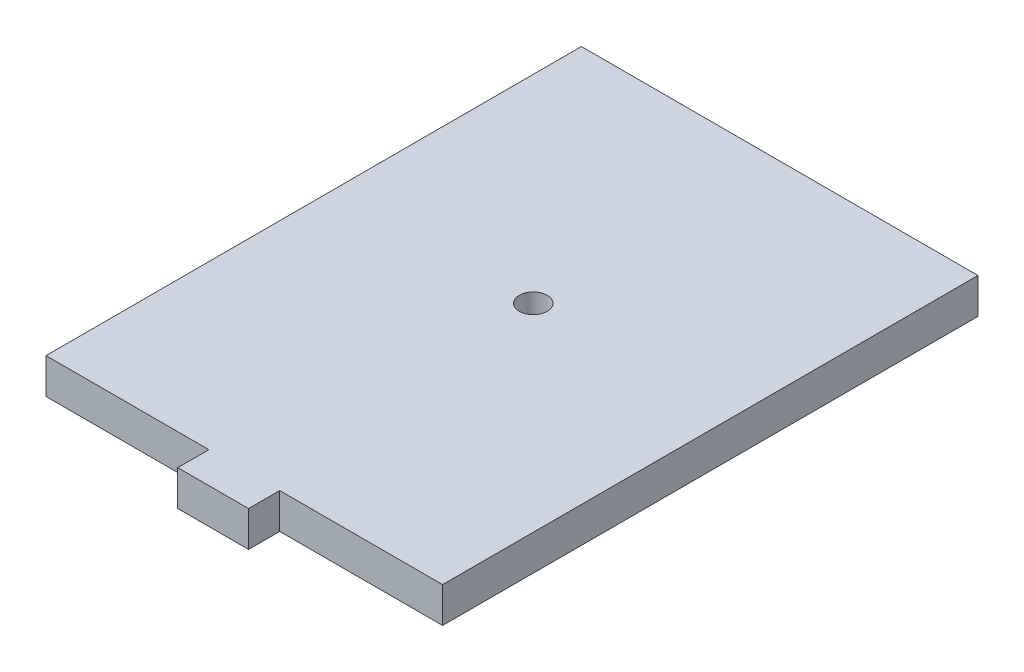
ISO-10303-21;
HEADER;
FILE_DESCRIPTION(('STEP AP214'),'2;1');
FILE_NAME('part.step','',(''),(''),'','','');
FILE_SCHEMA(('AUTOMOTIVE_DESIGN { 1 0 10303 214 1 1 1 1 }'));
ENDSEC;
DATA;
#1=APPLICATION_CONTEXT('core data for automotive mechanical design processes');
#2=APPLICATION_PROTOCOL_DEFINITION('international standard','automotive_design',2000,#1);
#3=PRODUCT_CONTEXT('',#1,'mechanical');
#4=PRODUCT('Part','Part','',(#3));
#5=PRODUCT_RELATED_PRODUCT_CATEGORY('part','',(#4));
#6=PRODUCT_DEFINITION_FORMATION('','',#4);
#7=PRODUCT_DEFINITION_CONTEXT('part definition',#1,'design');
#8=PRODUCT_DEFINITION('design','',#6,#7);
#9=PRODUCT_DEFINITION_SHAPE('','',#8);
#10=(LENGTH_UNIT() NAMED_UNIT(*) SI_UNIT(.MILLI.,.METRE.));
#11=(NAMED_UNIT(*) PLANE_ANGLE_UNIT() SI_UNIT($,.RADIAN.));
#12=(NAMED_UNIT(*) SI_UNIT($,.STERADIAN.) SOLID_ANGLE_UNIT());
#13=UNCERTAINTY_MEASURE_WITH_UNIT(LENGTH_MEASURE(1.E-05),#10,'distance_accuracy_value','');
#14=(GEOMETRIC_REPRESENTATION_CONTEXT(3) GLOBAL_UNCERTAINTY_ASSIGNED_CONTEXT((#13)) GLOBAL_UNIT_ASSIGNED_CONTEXT((#10,
#11,#12)) REPRESENTATION_CONTEXT('',''));
#15=CARTESIAN_POINT('',(0.,0.,0.));
#16=DIRECTION('',(0.,0.,1.));
#17=DIRECTION('',(1.,0.,0.));
#18=AXIS2_PLACEMENT_3D('',#15,#16,#17);
#19=CARTESIAN_POINT('',(0.,3.175,50.8));
#20=DIRECTION('',(1.,0.,0.));
#21=DIRECTION('',(0.,1.,0.));
#22=AXIS2_PLACEMENT_3D('',#19,#20,#21);
#23=PLANE('',#22);
#24=DIRECTION('',(0.,0.,-1.));
#25=VECTOR('',#24,1.);
#26=CARTESIAN_POINT('',(0.,0.,50.8));
#27=LINE('',#26,#25);
#28=CARTESIAN_POINT('',(0.,0.,48.006));
#29=VERTEX_POINT('',#28);
#30=CARTESIAN_POINT('',(0.,0.,0.));
#31=VERTEX_POINT('',#30);
#32=EDGE_CURVE('E11',#29,#31,#27,.T.);
#33=ORIENTED_EDGE('',*,*,#32,.F.);
#34=DIRECTION('',(0.,1.,0.));
#35=VECTOR('',#34,1.);
#36=CARTESIAN_POINT('',(0.,0.,48.006));
#37=LINE('',#36,#35);
#38=CARTESIAN_POINT('',(0.,3.175,48.006));
#39=VERTEX_POINT('',#38);
#40=EDGE_CURVE('E103',#29,#39,#37,.T.);
#41=ORIENTED_EDGE('',*,*,#40,.T.);
#42=DIRECTION('',(0.,0.,-1.));
#43=VECTOR('',#42,1.);
#44=CARTESIAN_POINT('',(0.,3.175,50.8));
#45=LINE('',#44,#43);
#46=CARTESIAN_POINT('',(0.,3.175,0.));
#47=VERTEX_POINT('',#46);
#48=EDGE_CURVE('E152',#39,#47,#45,.T.);
#49=ORIENTED_EDGE('',*,*,#48,.T.);
#50=DIRECTION('',(0.,-1.,0.));
#51=VECTOR('',#50,1.);
#52=CARTESIAN_POINT('',(0.,3.175,0.));
#53=LINE('',#52,#51);
#54=EDGE_CURVE('E144',#47,#31,#53,.T.);
#55=ORIENTED_EDGE('',*,*,#54,.T.);
#56=EDGE_LOOP('',(#33,#41,#49,#55));
#57=FACE_BOUND('',#56,.T.);
#58=ADVANCED_FACE('F35',(#57),#23,.F.);
#59=CARTESIAN_POINT('',(0.,0.,50.8));
#60=DIRECTION('',(0.,1.,0.));
#61=DIRECTION('',(-1.,0.,0.));
#62=AXIS2_PLACEMENT_3D('',#59,#60,#61);
#63=PLANE('',#62);
#64=CARTESIAN_POINT('',(17.78,0.,22.098));
#65=DIRECTION('',(0.,1.,0.));
#66=DIRECTION('',(-1.,0.,0.));
#67=AXIS2_PLACEMENT_3D('',#64,#65,#66);
#68=CIRCLE('',#67,1.25);
#69=CARTESIAN_POINT('',(16.53,0.,22.098));
#70=VERTEX_POINT('',#69);
#71=EDGE_CURVE('E141',#70,#70,#68,.T.);
#72=ORIENTED_EDGE('',*,*,#71,.T.);
#73=EDGE_LOOP('',(#72));
#74=FACE_BOUND('',#73,.T.);
#75=DIRECTION('',(0.,0.,-1.));
#76=VECTOR('',#75,1.);
#77=CARTESIAN_POINT('',(14.605,0.,50.8));
#78=LINE('',#77,#76);
#79=CARTESIAN_POINT('',(14.605,0.,50.8));
#80=VERTEX_POINT('',#79);
#81=CARTESIAN_POINT('',(14.605,0.,48.006));
#82=VERTEX_POINT('',#81);
#83=EDGE_CURVE('E57',#80,#82,#78,.T.);
#84=ORIENTED_EDGE('',*,*,#83,.T.);
#85=DIRECTION('',(-1.,0.,0.));
#86=VECTOR('',#85,1.);
#87=CARTESIAN_POINT('',(0.,0.,48.006));
#88=LINE('',#87,#86);
#89=EDGE_CURVE('E107',#82,#29,#88,.T.);
#90=ORIENTED_EDGE('',*,*,#89,.T.);
#91=ORIENTED_EDGE('',*,*,#32,.T.);
#92=DIRECTION('',(1.,0.,0.));
#93=VECTOR('',#92,1.);
#94=CARTESIAN_POINT('',(0.,0.,0.));
#95=LINE('',#94,#93);
#96=CARTESIAN_POINT('',(35.56,0.,0.));
#97=VERTEX_POINT('',#96);
#98=EDGE_CURVE('E155',#31,#97,#95,.T.);
#99=ORIENTED_EDGE('',*,*,#98,.T.);
#100=DIRECTION('',(0.,0.,-1.));
#101=VECTOR('',#100,1.);
#102=CARTESIAN_POINT('',(35.56,0.,50.8));
#103=LINE('',#102,#101);
#104=CARTESIAN_POINT('',(35.56,0.,48.006));
#105=VERTEX_POINT('',#104);
#106=EDGE_CURVE('E42',#105,#97,#103,.T.);
#107=ORIENTED_EDGE('',*,*,#106,.F.);
#108=DIRECTION('',(-1.,0.,0.));
#109=VECTOR('',#108,1.);
#110=CARTESIAN_POINT('',(35.56,0.,48.006));
#111=LINE('',#110,#109);
#112=CARTESIAN_POINT('',(20.955,0.,48.006));
#113=VERTEX_POINT('',#112);
#114=EDGE_CURVE('E127',#105,#113,#111,.T.);
#115=ORIENTED_EDGE('',*,*,#114,.T.);
#116=DIRECTION('',(0.,0.,1.));
#117=VECTOR('',#116,1.);
#118=CARTESIAN_POINT('',(20.955,0.,50.8));
#119=LINE('',#118,#117);
#120=CARTESIAN_POINT('',(20.955,0.,50.8));
#121=VERTEX_POINT('',#120);
#122=EDGE_CURVE('E130',#113,#121,#119,.T.);
#123=ORIENTED_EDGE('',*,*,#122,.T.);
#124=DIRECTION('',(1.,0.,0.));
#125=VECTOR('',#124,1.);
#126=CARTESIAN_POINT('',(0.,0.,50.8));
#127=LINE('',#126,#125);
#128=EDGE_CURVE('E117',#80,#121,#127,.T.);
#129=ORIENTED_EDGE('',*,*,#128,.F.);
#130=EDGE_LOOP('',(#84,#90,#91,#99,#107,#115,#123,#129));
#131=FACE_BOUND('',#130,.T.);
#132=ADVANCED_FACE('F114',(#74,#131),#63,.F.);
#133=CARTESIAN_POINT('',(35.56,0.,50.8));
#134=DIRECTION('',(-1.,0.,0.));
#135=DIRECTION('',(0.,0.,1.));
#136=AXIS2_PLACEMENT_3D('',#133,#134,#135);
#137=PLANE('',#136);
#138=DIRECTION('',(0.,0.,-1.));
#139=VECTOR('',#138,1.);
#140=CARTESIAN_POINT('',(35.56,3.175,50.8));
#141=LINE('',#140,#139);
#142=CARTESIAN_POINT('',(35.56,3.175,48.006));
#143=VERTEX_POINT('',#142);
#144=CARTESIAN_POINT('',(35.56,3.175,0.));
#145=VERTEX_POINT('',#144);
#146=EDGE_CURVE('E164',#143,#145,#141,.T.);
#147=ORIENTED_EDGE('',*,*,#146,.F.);
#148=DIRECTION('',(0.,1.,0.));
#149=VECTOR('',#148,1.);
#150=CARTESIAN_POINT('',(35.56,0.,48.006));
#151=LINE('',#150,#149);
#152=EDGE_CURVE('E132',#105,#143,#151,.T.);
#153=ORIENTED_EDGE('',*,*,#152,.F.);
#154=ORIENTED_EDGE('',*,*,#106,.T.);
#155=DIRECTION('',(0.,1.,0.));
#156=VECTOR('',#155,1.);
#157=CARTESIAN_POINT('',(35.56,0.,0.));
#158=LINE('',#157,#156);
#159=EDGE_CURVE('E158',#97,#145,#158,.T.);
#160=ORIENTED_EDGE('',*,*,#159,.T.);
#161=EDGE_LOOP('',(#147,#153,#154,#160));
#162=FACE_BOUND('',#161,.T.);
#163=ADVANCED_FACE('F169',(#162),#137,.F.);
#164=CARTESIAN_POINT('',(35.56,3.175,50.8));
#165=DIRECTION('',(0.,-1.,0.));
#166=DIRECTION('',(1.,0.,0.));
#167=AXIS2_PLACEMENT_3D('',#164,#165,#166);
#168=PLANE('',#167);
#169=CARTESIAN_POINT('',(17.78,3.175,22.098));
#170=DIRECTION('',(0.,1.,0.));
#171=DIRECTION('',(-1.,0.,0.));
#172=AXIS2_PLACEMENT_3D('',#169,#170,#171);
#173=CIRCLE('',#172,1.25);
#174=CARTESIAN_POINT('',(16.53,3.175,22.098));
#175=VERTEX_POINT('',#174);
#176=EDGE_CURVE('E124',#175,#175,#173,.T.);
#177=ORIENTED_EDGE('',*,*,#176,.F.);
#178=EDGE_LOOP('',(#177));
#179=FACE_BOUND('',#178,.T.);
#180=ORIENTED_EDGE('',*,*,#48,.F.);
#181=DIRECTION('',(-1.,0.,0.));
#182=VECTOR('',#181,1.);
#183=CARTESIAN_POINT('',(0.,3.175,48.006));
#184=LINE('',#183,#182);
#185=CARTESIAN_POINT('',(14.605,3.175,48.006));
#186=VERTEX_POINT('',#185);
#187=EDGE_CURVE('E118',#186,#39,#184,.T.);
#188=ORIENTED_EDGE('',*,*,#187,.F.);
#189=DIRECTION('',(0.,0.,-1.));
#190=VECTOR('',#189,1.);
#191=CARTESIAN_POINT('',(14.605,3.175,50.8));
#192=LINE('',#191,#190);
#193=CARTESIAN_POINT('',(14.605,3.175,50.8));
#194=VERTEX_POINT('',#193);
#195=EDGE_CURVE('E100',#194,#186,#192,.T.);
#196=ORIENTED_EDGE('',*,*,#195,.F.);
#197=DIRECTION('',(-1.,0.,0.));
#198=VECTOR('',#197,1.);
#199=CARTESIAN_POINT('',(35.56,3.175,50.8));
#200=LINE('',#199,#198);
#201=CARTESIAN_POINT('',(20.955,3.175,50.8));
#202=VERTEX_POINT('',#201);
#203=EDGE_CURVE('E148',#202,#194,#200,.T.);
#204=ORIENTED_EDGE('',*,*,#203,.F.);
#205=DIRECTION('',(0.,0.,1.));
#206=VECTOR('',#205,1.);
#207=CARTESIAN_POINT('',(20.955,3.175,50.8));
#208=LINE('',#207,#206);
#209=CARTESIAN_POINT('',(20.955,3.175,48.006));
#210=VERTEX_POINT('',#209);
#211=EDGE_CURVE('E49',#210,#202,#208,.T.);
#212=ORIENTED_EDGE('',*,*,#211,.F.);
#213=DIRECTION('',(-1.,0.,0.));
#214=VECTOR('',#213,1.);
#215=CARTESIAN_POINT('',(35.56,3.175,48.006));
#216=LINE('',#215,#214);
#217=EDGE_CURVE('E133',#143,#210,#216,.T.);
#218=ORIENTED_EDGE('',*,*,#217,.F.);
#219=ORIENTED_EDGE('',*,*,#146,.T.);
#220=DIRECTION('',(-1.,0.,0.));
#221=VECTOR('',#220,1.);
#222=CARTESIAN_POINT('',(35.56,3.175,0.));
#223=LINE('',#222,#221);
#224=EDGE_CURVE('E149',#145,#47,#223,.T.);
#225=ORIENTED_EDGE('',*,*,#224,.T.);
#226=EDGE_LOOP('',(#180,#188,#196,#204,#212,#218,#219,#225));
#227=FACE_BOUND('',#226,.T.);
#228=ADVANCED_FACE('F178',(#179,#227),#168,.F.);
#229=CARTESIAN_POINT('',(0.,0.,50.8));
#230=DIRECTION('',(0.,0.,1.));
#231=DIRECTION('',(1.,0.,0.));
#232=AXIS2_PLACEMENT_3D('',#229,#230,#231);
#233=PLANE('',#232);
#234=DIRECTION('',(0.,1.,0.));
#235=VECTOR('',#234,1.);
#236=CARTESIAN_POINT('',(14.605,0.,50.8));
#237=LINE('',#236,#235);
#238=EDGE_CURVE('E104',#80,#194,#237,.T.);
#239=ORIENTED_EDGE('',*,*,#238,.F.);
#240=ORIENTED_EDGE('',*,*,#128,.T.);
#241=DIRECTION('',(0.,1.,0.));
#242=VECTOR('',#241,1.);
#243=CARTESIAN_POINT('',(20.955,0.,50.8));
#244=LINE('',#243,#242);
#245=EDGE_CURVE('E122',#121,#202,#244,.T.);
#246=ORIENTED_EDGE('',*,*,#245,.T.);
#247=ORIENTED_EDGE('',*,*,#203,.T.);
#248=EDGE_LOOP('',(#239,#240,#246,#247));
#249=FACE_BOUND('',#248,.T.);
#250=ADVANCED_FACE('F185',(#249),#233,.T.);
#251=CARTESIAN_POINT('',(0.,0.,0.));
#252=DIRECTION('',(0.,0.,1.));
#253=DIRECTION('',(1.,0.,0.));
#254=AXIS2_PLACEMENT_3D('',#251,#252,#253);
#255=PLANE('',#254);
#256=ORIENTED_EDGE('',*,*,#54,.F.);
#257=ORIENTED_EDGE('',*,*,#224,.F.);
#258=ORIENTED_EDGE('',*,*,#159,.F.);
#259=ORIENTED_EDGE('',*,*,#98,.F.);
#260=EDGE_LOOP('',(#256,#257,#258,#259));
#261=FACE_BOUND('',#260,.T.);
#262=ADVANCED_FACE('F175',(#261),#255,.F.);
#263=CARTESIAN_POINT('',(17.78,0.,22.098));
#264=DIRECTION('',(0.,1.,0.));
#265=DIRECTION('',(-1.,0.,0.));
#266=AXIS2_PLACEMENT_3D('',#263,#264,#265);
#267=CYLINDRICAL_SURFACE('',#266,1.25);
#268=CARTESIAN_POINT('',(16.53,0.,22.098));
#269=CARTESIAN_POINT('',(16.53,0.033072916666664,22.098));
#270=CARTESIAN_POINT('',(16.53,0.0661458333333307,22.098));
#271=CARTESIAN_POINT('',(16.53,0.132291666666664,22.098));
#272=CARTESIAN_POINT('',(16.53,0.165364583333331,22.098));
#273=CARTESIAN_POINT('',(16.53,0.231510416666664,22.098));
#274=CARTESIAN_POINT('',(16.53,0.264583333333331,22.098));
#275=CARTESIAN_POINT('',(16.53,0.330729166666664,22.098));
#276=CARTESIAN_POINT('',(16.53,0.363802083333331,22.098));
#277=CARTESIAN_POINT('',(16.53,0.429947916666664,22.098));
#278=CARTESIAN_POINT('',(16.53,0.463020833333331,22.098));
#279=CARTESIAN_POINT('',(16.53,0.529166666666664,22.098));
#280=CARTESIAN_POINT('',(16.53,0.562239583333331,22.098));
#281=CARTESIAN_POINT('',(16.53,0.628385416666665,22.098));
#282=CARTESIAN_POINT('',(16.53,0.661458333333331,22.098));
#283=CARTESIAN_POINT('',(16.53,0.727604166666665,22.098));
#284=CARTESIAN_POINT('',(16.53,0.760677083333331,22.098));
#285=CARTESIAN_POINT('',(16.53,0.826822916666665,22.098));
#286=CARTESIAN_POINT('',(16.53,0.859895833333332,22.098));
#287=CARTESIAN_POINT('',(16.53,0.926041666666665,22.098));
#288=CARTESIAN_POINT('',(16.53,0.959114583333332,22.098));
#289=CARTESIAN_POINT('',(16.53,1.02526041666667,22.098));
#290=CARTESIAN_POINT('',(16.53,1.05833333333333,22.098));
#291=CARTESIAN_POINT('',(16.53,1.12447916666667,22.098));
#292=CARTESIAN_POINT('',(16.53,1.15755208333333,22.098));
#293=CARTESIAN_POINT('',(16.53,1.22369791666667,22.098));
#294=CARTESIAN_POINT('',(16.53,1.25677083333333,22.098));
#295=CARTESIAN_POINT('',(16.53,1.32291666666667,22.098));
#296=CARTESIAN_POINT('',(16.53,1.35598958333333,22.098));
#297=CARTESIAN_POINT('',(16.53,1.42213541666667,22.098));
#298=CARTESIAN_POINT('',(16.53,1.45520833333333,22.098));
#299=CARTESIAN_POINT('',(16.53,1.52135416666667,22.098));
#300=CARTESIAN_POINT('',(16.53,1.55442708333333,22.098));
#301=CARTESIAN_POINT('',(16.53,1.62057291666667,22.098));
#302=CARTESIAN_POINT('',(16.53,1.65364583333333,22.098));
#303=CARTESIAN_POINT('',(16.53,1.71979166666667,22.098));
#304=CARTESIAN_POINT('',(16.53,1.75286458333333,22.098));
#305=CARTESIAN_POINT('',(16.53,1.81901041666667,22.098));
#306=CARTESIAN_POINT('',(16.53,1.85208333333333,22.098));
#307=CARTESIAN_POINT('',(16.53,1.91822916666667,22.098));
#308=CARTESIAN_POINT('',(16.53,1.95130208333333,22.098));
#309=CARTESIAN_POINT('',(16.53,2.01744791666667,22.098));
#310=CARTESIAN_POINT('',(16.53,2.05052083333333,22.098));
#311=CARTESIAN_POINT('',(16.53,2.11666666666667,22.098));
#312=CARTESIAN_POINT('',(16.53,2.14973958333333,22.098));
#313=CARTESIAN_POINT('',(16.53,2.21588541666667,22.098));
#314=CARTESIAN_POINT('',(16.53,2.24895833333333,22.098));
#315=CARTESIAN_POINT('',(16.53,2.31510416666667,22.098));
#316=CARTESIAN_POINT('',(16.53,2.34817708333333,22.098));
#317=CARTESIAN_POINT('',(16.53,2.41432291666667,22.098));
#318=CARTESIAN_POINT('',(16.53,2.44739583333333,22.098));
#319=CARTESIAN_POINT('',(16.53,2.51354166666667,22.098));
#320=CARTESIAN_POINT('',(16.53,2.54661458333333,22.098));
#321=CARTESIAN_POINT('',(16.53,2.61276041666667,22.098));
#322=CARTESIAN_POINT('',(16.53,2.64583333333333,22.098));
#323=CARTESIAN_POINT('',(16.53,2.71197916666667,22.098));
#324=CARTESIAN_POINT('',(16.53,2.74505208333333,22.098));
#325=CARTESIAN_POINT('',(16.53,2.81119791666667,22.098));
#326=CARTESIAN_POINT('',(16.53,2.84427083333333,22.098));
#327=CARTESIAN_POINT('',(16.53,2.91041666666667,22.098));
#328=CARTESIAN_POINT('',(16.53,2.94348958333333,22.098));
#329=CARTESIAN_POINT('',(16.53,3.00963541666667,22.098));
#330=CARTESIAN_POINT('',(16.53,3.04270833333333,22.098));
#331=CARTESIAN_POINT('',(16.53,3.10885416666667,22.098));
#332=CARTESIAN_POINT('',(16.53,3.14192708333333,22.098));
#333=CARTESIAN_POINT('',(16.53,3.175,22.098));
#334=B_SPLINE_CURVE_WITH_KNOTS('',3,(#268,#269,#270,#271,#272,#273,#274,#275,#276,#277,#278,
#279,#280,#281,#282,#283,#284,#285,#286,#287,#288,#289,#290,#291,#292,#293,#294,#295,#296,#297,
#298,#299,#300,#301,#302,#303,#304,#305,#306,#307,#308,#309,#310,#311,#312,#313,#314,#315,#316,
#317,#318,#319,#320,#321,#322,#323,#324,#325,#326,#327,#328,#329,#330,#331,#332,#333),
.UNSPECIFIED.,.F.,.F.,(4,2,2,2,2,2,2,2,2,2,2,2,2,2,2,2,2,2,2,2,2,2,2,2,2,2,2,2,2,2,2,2,4),(0.,
0.0992187500000001,0.1984375,0.29765625,0.396875,0.49609375,0.595312500000001,0.694531250000001,
0.793750000000001,0.892968750000001,0.992187500000001,1.09140625,1.190625,1.28984375,1.3890625,
1.48828125,1.5875,1.68671875,1.7859375,1.88515625,1.984375,2.08359375,2.1828125,2.28203125,
2.38125,2.48046875,2.5796875,2.67890625,2.778125,2.87734375,2.9765625,3.07578125,3.175),.UNSPECIFIED.);
#335=EDGE_CURVE('BSEAM202',#70,#175,#334,.T.);
#336=ORIENTED_EDGE('',*,*,#71,.F.);
#337=ORIENTED_EDGE('',*,*,#176,.T.);
#338=ORIENTED_EDGE('',*,*,#335,.T.);
#339=ORIENTED_EDGE('',*,*,#335,.F.);
#340=EDGE_LOOP('',(#336,#338,#337,#339));
#341=FACE_BOUND('',#340,.T.);
#342=ADVANCED_FACE('F202',(#341),#267,.F.);
#343=CARTESIAN_POINT('',(20.955,0.,50.8));
#344=DIRECTION('',(-1.,0.,0.));
#345=DIRECTION('',(0.,-1.,0.));
#346=AXIS2_PLACEMENT_3D('',#343,#344,#345);
#347=PLANE('',#346);
#348=ORIENTED_EDGE('',*,*,#211,.T.);
#349=ORIENTED_EDGE('',*,*,#245,.F.);
#350=ORIENTED_EDGE('',*,*,#122,.F.);
#351=DIRECTION('',(0.,1.,0.));
#352=VECTOR('',#351,1.);
#353=CARTESIAN_POINT('',(20.955,0.,48.006));
#354=LINE('',#353,#352);
#355=EDGE_CURVE('E138',#113,#210,#354,.T.);
#356=ORIENTED_EDGE('',*,*,#355,.T.);
#357=EDGE_LOOP('',(#348,#349,#350,#356));
#358=FACE_BOUND('',#357,.T.);
#359=ADVANCED_FACE('F207',(#358),#347,.F.);
#360=CARTESIAN_POINT('',(35.56,0.,48.006));
#361=DIRECTION('',(0.,0.,-1.));
#362=DIRECTION('',(-1.,0.,0.));
#363=AXIS2_PLACEMENT_3D('',#360,#361,#362);
#364=PLANE('',#363);
#365=ORIENTED_EDGE('',*,*,#217,.T.);
#366=ORIENTED_EDGE('',*,*,#355,.F.);
#367=ORIENTED_EDGE('',*,*,#114,.F.);
#368=ORIENTED_EDGE('',*,*,#152,.T.);
#369=EDGE_LOOP('',(#365,#366,#367,#368));
#370=FACE_BOUND('',#369,.T.);
#371=ADVANCED_FACE('F182',(#370),#364,.F.);
#372=CARTESIAN_POINT('',(0.,0.,48.006));
#373=DIRECTION('',(0.,0.,-1.));
#374=DIRECTION('',(-1.,0.,0.));
#375=AXIS2_PLACEMENT_3D('',#372,#373,#374);
#376=PLANE('',#375);
#377=ORIENTED_EDGE('',*,*,#187,.T.);
#378=ORIENTED_EDGE('',*,*,#40,.F.);
#379=ORIENTED_EDGE('',*,*,#89,.F.);
#380=DIRECTION('',(0.,1.,0.));
#381=VECTOR('',#380,1.);
#382=CARTESIAN_POINT('',(14.605,0.,48.006));
#383=LINE('',#382,#381);
#384=EDGE_CURVE('E96',#82,#186,#383,.T.);
#385=ORIENTED_EDGE('',*,*,#384,.T.);
#386=EDGE_LOOP('',(#377,#378,#379,#385));
#387=FACE_BOUND('',#386,.T.);
#388=ADVANCED_FACE('F108',(#387),#376,.F.);
#389=CARTESIAN_POINT('',(14.605,0.,50.8));
#390=DIRECTION('',(1.,0.,0.));
#391=DIRECTION('',(0.,1.,0.));
#392=AXIS2_PLACEMENT_3D('',#389,#390,#391);
#393=PLANE('',#392);
#394=ORIENTED_EDGE('',*,*,#195,.T.);
#395=ORIENTED_EDGE('',*,*,#384,.F.);
#396=ORIENTED_EDGE('',*,*,#83,.F.);
#397=ORIENTED_EDGE('',*,*,#238,.T.);
#398=EDGE_LOOP('',(#394,#395,#396,#397));
#399=FACE_BOUND('',#398,.T.);
#400=ADVANCED_FACE('F98',(#399),#393,.F.);
#401=CLOSED_SHELL('',(#58,#132,#163,#228,#250,#262,#342,#359,#371,#388,#400));
#402=MANIFOLD_SOLID_BREP('B2',#401);
#403=ADVANCED_BREP_SHAPE_REPRESENTATION('',(#18,#402),#14);
#404=SHAPE_DEFINITION_REPRESENTATION(#9,#403);
ENDSEC;
END-ISO-10303-21;
